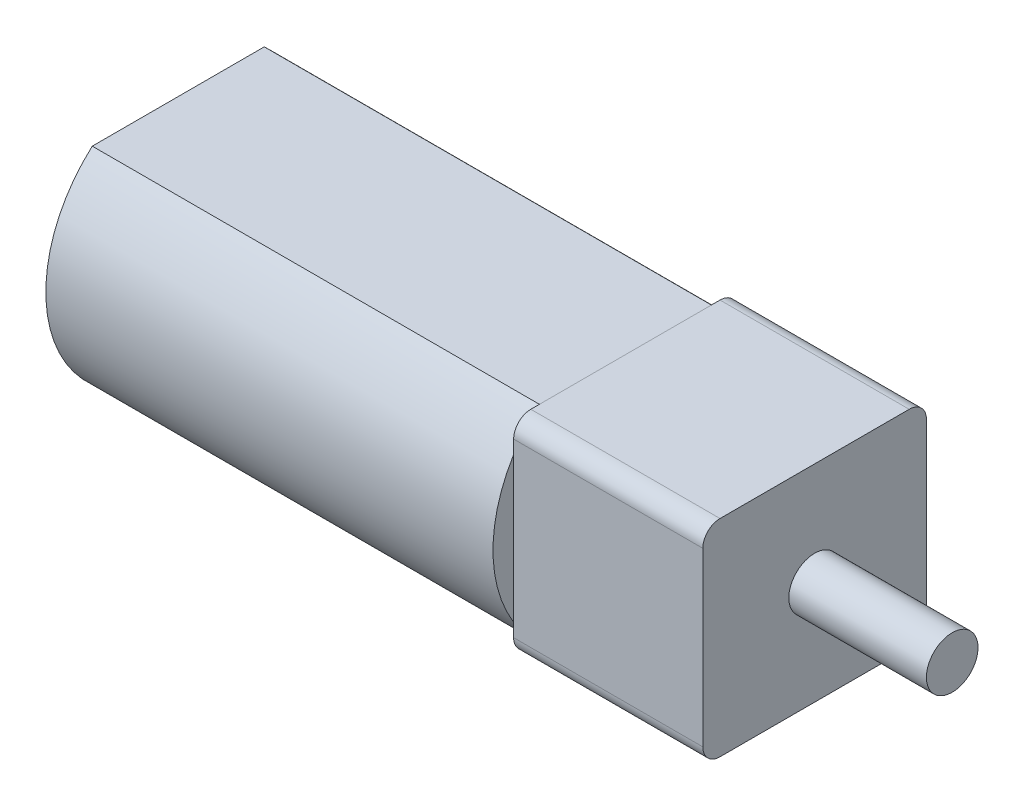
ISO-10303-21;
HEADER;
FILE_DESCRIPTION(('STEP AP214'),'2;1');
FILE_NAME('part.step','',(''),(''),'','','');
FILE_SCHEMA(('AUTOMOTIVE_DESIGN { 1 0 10303 214 1 1 1 1 }'));
ENDSEC;
DATA;
#1=APPLICATION_CONTEXT('core data for automotive mechanical design processes');
#2=APPLICATION_PROTOCOL_DEFINITION('international standard','automotive_design',2000,#1);
#3=PRODUCT_CONTEXT('',#1,'mechanical');
#4=PRODUCT('Part','Part','',(#3));
#5=PRODUCT_RELATED_PRODUCT_CATEGORY('part','',(#4));
#6=PRODUCT_DEFINITION_FORMATION('','',#4);
#7=PRODUCT_DEFINITION_CONTEXT('part definition',#1,'design');
#8=PRODUCT_DEFINITION('design','',#6,#7);
#9=PRODUCT_DEFINITION_SHAPE('','',#8);
#10=(LENGTH_UNIT() NAMED_UNIT(*) SI_UNIT(.MILLI.,.METRE.));
#11=(NAMED_UNIT(*) PLANE_ANGLE_UNIT() SI_UNIT($,.RADIAN.));
#12=(NAMED_UNIT(*) SI_UNIT($,.STERADIAN.) SOLID_ANGLE_UNIT());
#13=UNCERTAINTY_MEASURE_WITH_UNIT(LENGTH_MEASURE(1.E-05),#10,'distance_accuracy_value','');
#14=(GEOMETRIC_REPRESENTATION_CONTEXT(3) GLOBAL_UNCERTAINTY_ASSIGNED_CONTEXT((#13)) GLOBAL_UNIT_ASSIGNED_CONTEXT((#10,
#11,#12)) REPRESENTATION_CONTEXT('',''));
#15=CARTESIAN_POINT('',(0.,0.,0.));
#16=DIRECTION('',(0.,0.,1.));
#17=DIRECTION('',(1.,0.,0.));
#18=AXIS2_PLACEMENT_3D('',#15,#16,#17);
#19=CARTESIAN_POINT('',(45.,6.,-7.7));
#20=DIRECTION('',(-1.,0.,0.));
#21=DIRECTION('',(0.,0.,1.));
#22=AXIS2_PLACEMENT_3D('',#19,#20,#21);
#23=CYLINDRICAL_SURFACE('',#22,1.5);
#24=CARTESIAN_POINT('',(45.,6.,-7.7));
#25=DIRECTION('',(1.,0.,0.));
#26=DIRECTION('',(0.,0.,-1.));
#27=AXIS2_PLACEMENT_3D('',#24,#25,#26);
#28=CIRCLE('',#27,1.5);
#29=CARTESIAN_POINT('',(45.,6.,-9.2));
#30=VERTEX_POINT('',#29);
#31=EDGE_CURVE('E11',#30,#30,#28,.T.);
#32=ORIENTED_EDGE('',*,*,#31,.F.);
#33=EDGE_LOOP('',(#32));
#34=FACE_BOUND('',#33,.T.);
#35=CARTESIAN_POINT('',(37.,6.,-7.7));
#36=DIRECTION('',(1.,0.,0.));
#37=DIRECTION('',(0.,0.,-1.));
#38=AXIS2_PLACEMENT_3D('',#35,#36,#37);
#39=CIRCLE('',#38,1.5);
#40=CARTESIAN_POINT('',(37.,6.,-9.2));
#41=VERTEX_POINT('',#40);
#42=EDGE_CURVE('E59',#41,#41,#39,.T.);
#43=ORIENTED_EDGE('',*,*,#42,.T.);
#44=EDGE_LOOP('',(#43));
#45=FACE_BOUND('',#44,.T.);
#46=ADVANCED_FACE('F56',(#34,#45),#23,.T.);
#47=CARTESIAN_POINT('',(45.,6.,-7.7));
#48=DIRECTION('',(1.,0.,0.));
#49=DIRECTION('',(0.,0.,-1.));
#50=AXIS2_PLACEMENT_3D('',#47,#48,#49);
#51=PLANE('',#50);
#52=ORIENTED_EDGE('',*,*,#31,.T.);
#53=EDGE_LOOP('',(#52));
#54=FACE_BOUND('',#53,.T.);
#55=ADVANCED_FACE('F71',(#54),#51,.T.);
#56=CARTESIAN_POINT('',(37.,6.,-7.7));
#57=DIRECTION('',(1.,0.,0.));
#58=DIRECTION('',(0.,0.,-1.));
#59=AXIS2_PLACEMENT_3D('',#56,#57,#58);
#60=PLANE('',#59);
#61=ORIENTED_EDGE('',*,*,#42,.F.);
#62=EDGE_LOOP('',(#61));
#63=FACE_BOUND('',#62,.T.);
#64=ADVANCED_FACE('F69',(#63),#60,.F.);
#65=CLOSED_SHELL('',(#46,#55,#64));
#66=MANIFOLD_SOLID_BREP('B2',#65);
#67=CARTESIAN_POINT('',(37.,0.,-14.2));
#68=DIRECTION('',(0.,0.,1.));
#69=DIRECTION('',(1.,0.,0.));
#70=AXIS2_PLACEMENT_3D('',#67,#68,#69);
#71=PLANE('',#70);
#72=DIRECTION('',(0.,1.,0.));
#73=VECTOR('',#72,1.);
#74=CARTESIAN_POINT('',(37.,0.,-14.2));
#75=LINE('',#74,#73);
#76=CARTESIAN_POINT('',(37.,1.,-14.2));
#77=VERTEX_POINT('',#76);
#78=CARTESIAN_POINT('',(37.,11.,-14.2));
#79=VERTEX_POINT('',#78);
#80=EDGE_CURVE('E204',#77,#79,#75,.T.);
#81=ORIENTED_EDGE('',*,*,#80,.F.);
#82=DIRECTION('',(-1.,0.,0.));
#83=VECTOR('',#82,1.);
#84=CARTESIAN_POINT('',(37.,1.,-14.2));
#85=LINE('',#84,#83);
#86=CARTESIAN_POINT('',(26.,1.,-14.2));
#87=VERTEX_POINT('',#86);
#88=EDGE_CURVE('E230',#77,#87,#85,.T.);
#89=ORIENTED_EDGE('',*,*,#88,.T.);
#90=DIRECTION('',(0.,1.,0.));
#91=VECTOR('',#90,1.);
#92=CARTESIAN_POINT('',(26.,0.,-14.2));
#93=LINE('',#92,#91);
#94=CARTESIAN_POINT('',(26.,11.,-14.2));
#95=VERTEX_POINT('',#94);
#96=EDGE_CURVE('E236',#87,#95,#93,.T.);
#97=ORIENTED_EDGE('',*,*,#96,.T.);
#98=DIRECTION('',(-1.,0.,0.));
#99=VECTOR('',#98,1.);
#100=CARTESIAN_POINT('',(37.,11.,-14.2));
#101=LINE('',#100,#99);
#102=EDGE_CURVE('E228',#95,#79,#101,.F.);
#103=ORIENTED_EDGE('',*,*,#102,.T.);
#104=EDGE_LOOP('',(#81,#89,#97,#103));
#105=FACE_BOUND('',#104,.T.);
#106=ADVANCED_FACE('F112',(#105),#71,.F.);
#107=CARTESIAN_POINT('',(37.,12.,-1.2));
#108=DIRECTION('',(0.,-1.,0.));
#109=DIRECTION('',(0.,0.,-1.));
#110=AXIS2_PLACEMENT_3D('',#107,#108,#109);
#111=PLANE('',#110);
#112=DIRECTION('',(0.,0.,1.));
#113=VECTOR('',#112,1.);
#114=CARTESIAN_POINT('',(37.,12.,-1.2));
#115=LINE('',#114,#113);
#116=CARTESIAN_POINT('',(37.,12.,-13.2));
#117=VERTEX_POINT('',#116);
#118=CARTESIAN_POINT('',(37.,12.,-2.2));
#119=VERTEX_POINT('',#118);
#120=EDGE_CURVE('E207',#117,#119,#115,.T.);
#121=ORIENTED_EDGE('',*,*,#120,.F.);
#122=DIRECTION('',(-1.,0.,0.));
#123=VECTOR('',#122,1.);
#124=CARTESIAN_POINT('',(37.,12.,-13.2));
#125=LINE('',#124,#123);
#126=CARTESIAN_POINT('',(26.,12.,-13.2));
#127=VERTEX_POINT('',#126);
#128=EDGE_CURVE('E54',#117,#127,#125,.T.);
#129=ORIENTED_EDGE('',*,*,#128,.T.);
#130=DIRECTION('',(0.,0.,1.));
#131=VECTOR('',#130,1.);
#132=CARTESIAN_POINT('',(26.,12.,-1.2));
#133=LINE('',#132,#131);
#134=CARTESIAN_POINT('',(26.,12.,-2.2));
#135=VERTEX_POINT('',#134);
#136=EDGE_CURVE('E209',#127,#135,#133,.T.);
#137=ORIENTED_EDGE('',*,*,#136,.T.);
#138=DIRECTION('',(-1.,0.,0.));
#139=VECTOR('',#138,1.);
#140=CARTESIAN_POINT('',(37.,12.,-2.2));
#141=LINE('',#140,#139);
#142=EDGE_CURVE('E120',#135,#119,#141,.F.);
#143=ORIENTED_EDGE('',*,*,#142,.T.);
#144=EDGE_LOOP('',(#121,#129,#137,#143));
#145=FACE_BOUND('',#144,.T.);
#146=ADVANCED_FACE('F255',(#145),#111,.F.);
#147=CARTESIAN_POINT('',(37.,0.,-1.2));
#148=DIRECTION('',(0.,0.,-1.));
#149=DIRECTION('',(-1.,0.,0.));
#150=AXIS2_PLACEMENT_3D('',#147,#148,#149);
#151=PLANE('',#150);
#152=DIRECTION('',(0.,-1.,0.));
#153=VECTOR('',#152,1.);
#154=CARTESIAN_POINT('',(26.,0.,-1.2));
#155=LINE('',#154,#153);
#156=CARTESIAN_POINT('',(26.,11.,-1.2));
#157=VERTEX_POINT('',#156);
#158=CARTESIAN_POINT('',(26.,1.,-1.2));
#159=VERTEX_POINT('',#158);
#160=EDGE_CURVE('E205',#157,#159,#155,.T.);
#161=ORIENTED_EDGE('',*,*,#160,.T.);
#162=DIRECTION('',(-1.,0.,0.));
#163=VECTOR('',#162,1.);
#164=CARTESIAN_POINT('',(37.,1.,-1.2));
#165=LINE('',#164,#163);
#166=CARTESIAN_POINT('',(37.,1.,-1.2));
#167=VERTEX_POINT('',#166);
#168=EDGE_CURVE('E183',#159,#167,#165,.F.);
#169=ORIENTED_EDGE('',*,*,#168,.T.);
#170=DIRECTION('',(0.,-1.,0.));
#171=VECTOR('',#170,1.);
#172=CARTESIAN_POINT('',(37.,0.,-1.2));
#173=LINE('',#172,#171);
#174=CARTESIAN_POINT('',(37.,11.,-1.2));
#175=VERTEX_POINT('',#174);
#176=EDGE_CURVE('E244',#175,#167,#173,.T.);
#177=ORIENTED_EDGE('',*,*,#176,.F.);
#178=DIRECTION('',(-1.,0.,0.));
#179=VECTOR('',#178,1.);
#180=CARTESIAN_POINT('',(37.,11.,-1.2));
#181=LINE('',#180,#179);
#182=EDGE_CURVE('E188',#175,#157,#181,.T.);
#183=ORIENTED_EDGE('',*,*,#182,.T.);
#184=EDGE_LOOP('',(#161,#169,#177,#183));
#185=FACE_BOUND('',#184,.T.);
#186=ADVANCED_FACE('F254',(#185),#151,.F.);
#187=CARTESIAN_POINT('',(37.,0.,-1.2));
#188=DIRECTION('',(0.,1.,0.));
#189=DIRECTION('',(0.,0.,1.));
#190=AXIS2_PLACEMENT_3D('',#187,#188,#189);
#191=PLANE('',#190);
#192=DIRECTION('',(0.,0.,-1.));
#193=VECTOR('',#192,1.);
#194=CARTESIAN_POINT('',(37.,0.,-1.2));
#195=LINE('',#194,#193);
#196=CARTESIAN_POINT('',(37.,0.,-2.2));
#197=VERTEX_POINT('',#196);
#198=CARTESIAN_POINT('',(37.,0.,-13.2));
#199=VERTEX_POINT('',#198);
#200=EDGE_CURVE('E198',#197,#199,#195,.T.);
#201=ORIENTED_EDGE('',*,*,#200,.F.);
#202=DIRECTION('',(-1.,0.,0.));
#203=VECTOR('',#202,1.);
#204=CARTESIAN_POINT('',(37.,0.,-2.2));
#205=LINE('',#204,#203);
#206=CARTESIAN_POINT('',(26.,0.,-2.2));
#207=VERTEX_POINT('',#206);
#208=EDGE_CURVE('E182',#197,#207,#205,.T.);
#209=ORIENTED_EDGE('',*,*,#208,.T.);
#210=DIRECTION('',(0.,0.,-1.));
#211=VECTOR('',#210,1.);
#212=CARTESIAN_POINT('',(26.,0.,-1.2));
#213=LINE('',#212,#211);
#214=CARTESIAN_POINT('',(26.,0.,-13.2));
#215=VERTEX_POINT('',#214);
#216=EDGE_CURVE('E195',#207,#215,#213,.T.);
#217=ORIENTED_EDGE('',*,*,#216,.T.);
#218=DIRECTION('',(-1.,0.,0.));
#219=VECTOR('',#218,1.);
#220=CARTESIAN_POINT('',(37.,0.,-13.2));
#221=LINE('',#220,#219);
#222=EDGE_CURVE('E200',#215,#199,#221,.F.);
#223=ORIENTED_EDGE('',*,*,#222,.T.);
#224=EDGE_LOOP('',(#201,#209,#217,#223));
#225=FACE_BOUND('',#224,.T.);
#226=ADVANCED_FACE('F194',(#225),#191,.F.);
#227=CARTESIAN_POINT('',(37.,0.,0.));
#228=DIRECTION('',(-1.,0.,0.));
#229=DIRECTION('',(0.,0.,1.));
#230=AXIS2_PLACEMENT_3D('',#227,#228,#229);
#231=PLANE('',#230);
#232=ORIENTED_EDGE('',*,*,#176,.T.);
#233=CARTESIAN_POINT('',(37.,1.,-2.2));
#234=DIRECTION('',(-1.,0.,0.));
#235=DIRECTION('',(0.,0.,1.));
#236=AXIS2_PLACEMENT_3D('',#233,#234,#235);
#237=CIRCLE('',#236,1.);
#238=EDGE_CURVE('E226',#167,#197,#237,.F.);
#239=ORIENTED_EDGE('',*,*,#238,.T.);
#240=ORIENTED_EDGE('',*,*,#200,.T.);
#241=CARTESIAN_POINT('',(37.,1.,-13.2));
#242=DIRECTION('',(-1.,0.,0.));
#243=DIRECTION('',(0.,0.,1.));
#244=AXIS2_PLACEMENT_3D('',#241,#242,#243);
#245=CIRCLE('',#244,1.);
#246=EDGE_CURVE('E224',#199,#77,#245,.F.);
#247=ORIENTED_EDGE('',*,*,#246,.T.);
#248=ORIENTED_EDGE('',*,*,#80,.T.);
#249=CARTESIAN_POINT('',(37.,11.,-13.2));
#250=DIRECTION('',(-1.,0.,0.));
#251=DIRECTION('',(0.,0.,1.));
#252=AXIS2_PLACEMENT_3D('',#249,#250,#251);
#253=CIRCLE('',#252,1.);
#254=EDGE_CURVE('E133',#79,#117,#253,.F.);
#255=ORIENTED_EDGE('',*,*,#254,.T.);
#256=ORIENTED_EDGE('',*,*,#120,.T.);
#257=CARTESIAN_POINT('',(37.,11.,-2.2));
#258=DIRECTION('',(-1.,0.,0.));
#259=DIRECTION('',(0.,0.,1.));
#260=AXIS2_PLACEMENT_3D('',#257,#258,#259);
#261=CIRCLE('',#260,1.);
#262=EDGE_CURVE('E221',#119,#175,#261,.F.);
#263=ORIENTED_EDGE('',*,*,#262,.T.);
#264=EDGE_LOOP('',(#232,#239,#240,#247,#248,#255,#256,#263));
#265=FACE_BOUND('',#264,.T.);
#266=ADVANCED_FACE('F248',(#265),#231,.F.);
#267=CARTESIAN_POINT('',(26.,0.,0.));
#268=DIRECTION('',(-1.,0.,0.));
#269=DIRECTION('',(0.,0.,1.));
#270=AXIS2_PLACEMENT_3D('',#267,#268,#269);
#271=PLANE('',#270);
#272=ORIENTED_EDGE('',*,*,#216,.F.);
#273=CARTESIAN_POINT('',(26.,1.,-2.2));
#274=DIRECTION('',(-1.,0.,0.));
#275=DIRECTION('',(0.,0.,1.));
#276=AXIS2_PLACEMENT_3D('',#273,#274,#275);
#277=CIRCLE('',#276,1.);
#278=EDGE_CURVE('E178',#207,#159,#277,.T.);
#279=ORIENTED_EDGE('',*,*,#278,.T.);
#280=ORIENTED_EDGE('',*,*,#160,.F.);
#281=CARTESIAN_POINT('',(26.,11.,-2.2));
#282=DIRECTION('',(-1.,0.,0.));
#283=DIRECTION('',(0.,0.,1.));
#284=AXIS2_PLACEMENT_3D('',#281,#282,#283);
#285=CIRCLE('',#284,1.);
#286=EDGE_CURVE('E199',#157,#135,#285,.T.);
#287=ORIENTED_EDGE('',*,*,#286,.T.);
#288=ORIENTED_EDGE('',*,*,#136,.F.);
#289=CARTESIAN_POINT('',(26.,11.,-13.2));
#290=DIRECTION('',(-1.,0.,0.));
#291=DIRECTION('',(0.,0.,1.));
#292=AXIS2_PLACEMENT_3D('',#289,#290,#291);
#293=CIRCLE('',#292,1.);
#294=EDGE_CURVE('E215',#127,#95,#293,.T.);
#295=ORIENTED_EDGE('',*,*,#294,.T.);
#296=ORIENTED_EDGE('',*,*,#96,.F.);
#297=CARTESIAN_POINT('',(26.,1.,-13.2));
#298=DIRECTION('',(-1.,0.,0.));
#299=DIRECTION('',(0.,0.,1.));
#300=AXIS2_PLACEMENT_3D('',#297,#298,#299);
#301=CIRCLE('',#300,1.);
#302=EDGE_CURVE('E189',#87,#215,#301,.T.);
#303=ORIENTED_EDGE('',*,*,#302,.T.);
#304=EDGE_LOOP('',(#272,#279,#280,#287,#288,#295,#296,#303));
#305=FACE_BOUND('',#304,.T.);
#306=ADVANCED_FACE('F202',(#305),#271,.T.);
#307=CARTESIAN_POINT('',(37.,1.,-2.2));
#308=DIRECTION('',(-1.,0.,0.));
#309=DIRECTION('',(0.,0.,1.));
#310=AXIS2_PLACEMENT_3D('',#307,#308,#309);
#311=CYLINDRICAL_SURFACE('',#310,1.);
#312=ORIENTED_EDGE('',*,*,#238,.F.);
#313=ORIENTED_EDGE('',*,*,#168,.F.);
#314=ORIENTED_EDGE('',*,*,#278,.F.);
#315=ORIENTED_EDGE('',*,*,#208,.F.);
#316=EDGE_LOOP('',(#312,#313,#314,#315));
#317=FACE_BOUND('',#316,.T.);
#318=ADVANCED_FACE('F181',(#317),#311,.T.);
#319=CARTESIAN_POINT('',(37.,1.,-13.2));
#320=DIRECTION('',(-1.,0.,0.));
#321=DIRECTION('',(0.,0.,1.));
#322=AXIS2_PLACEMENT_3D('',#319,#320,#321);
#323=CYLINDRICAL_SURFACE('',#322,1.);
#324=ORIENTED_EDGE('',*,*,#246,.F.);
#325=ORIENTED_EDGE('',*,*,#222,.F.);
#326=ORIENTED_EDGE('',*,*,#302,.F.);
#327=ORIENTED_EDGE('',*,*,#88,.F.);
#328=EDGE_LOOP('',(#324,#325,#326,#327));
#329=FACE_BOUND('',#328,.T.);
#330=ADVANCED_FACE('F258',(#329),#323,.T.);
#331=CARTESIAN_POINT('',(37.,11.,-13.2));
#332=DIRECTION('',(-1.,0.,0.));
#333=DIRECTION('',(0.,0.,1.));
#334=AXIS2_PLACEMENT_3D('',#331,#332,#333);
#335=CYLINDRICAL_SURFACE('',#334,1.);
#336=ORIENTED_EDGE('',*,*,#254,.F.);
#337=ORIENTED_EDGE('',*,*,#102,.F.);
#338=ORIENTED_EDGE('',*,*,#294,.F.);
#339=ORIENTED_EDGE('',*,*,#128,.F.);
#340=EDGE_LOOP('',(#336,#337,#338,#339));
#341=FACE_BOUND('',#340,.T.);
#342=ADVANCED_FACE('F257',(#341),#335,.T.);
#343=CARTESIAN_POINT('',(37.,11.,-2.2));
#344=DIRECTION('',(-1.,0.,0.));
#345=DIRECTION('',(0.,0.,1.));
#346=AXIS2_PLACEMENT_3D('',#343,#344,#345);
#347=CYLINDRICAL_SURFACE('',#346,1.);
#348=ORIENTED_EDGE('',*,*,#262,.F.);
#349=ORIENTED_EDGE('',*,*,#142,.F.);
#350=ORIENTED_EDGE('',*,*,#286,.F.);
#351=ORIENTED_EDGE('',*,*,#182,.F.);
#352=EDGE_LOOP('',(#348,#349,#350,#351));
#353=FACE_BOUND('',#352,.T.);
#354=ADVANCED_FACE('F114',(#353),#347,.T.);
#355=CLOSED_SHELL('',(#106,#146,#186,#226,#266,#306,#318,#330,#342,#354));
#356=MANIFOLD_SOLID_BREP('B6',#355);
#357=CARTESIAN_POINT('',(26.,6.,-8.01666666666667));
#358=DIRECTION('',(-1.,0.,0.));
#359=DIRECTION('',(0.,0.,1.));
#360=AXIS2_PLACEMENT_3D('',#357,#358,#359);
#361=CYLINDRICAL_SURFACE('',#360,8.01666666666667);
#362=CARTESIAN_POINT('',(0.,6.,-8.01666666666667));
#363=DIRECTION('',(1.,0.,0.));
#364=DIRECTION('',(0.,0.,-1.));
#365=AXIS2_PLACEMENT_3D('',#362,#363,#364);
#366=CIRCLE('',#365,8.01666666666667);
#367=CARTESIAN_POINT('',(0.,12.,-2.7));
#368=VERTEX_POINT('',#367);
#369=CARTESIAN_POINT('',(0.,0.,-2.7));
#370=VERTEX_POINT('',#369);
#371=EDGE_CURVE('E442',#368,#370,#366,.T.);
#372=ORIENTED_EDGE('',*,*,#371,.T.);
#373=DIRECTION('',(-1.,0.,0.));
#374=VECTOR('',#373,1.);
#375=CARTESIAN_POINT('',(26.,0.,-2.7));
#376=LINE('',#375,#374);
#377=CARTESIAN_POINT('',(26.,0.,-2.7));
#378=VERTEX_POINT('',#377);
#379=EDGE_CURVE('E433',#378,#370,#376,.T.);
#380=ORIENTED_EDGE('',*,*,#379,.F.);
#381=CARTESIAN_POINT('',(26.,6.,-8.01666666666667));
#382=DIRECTION('',(1.,0.,0.));
#383=DIRECTION('',(0.,0.,-1.));
#384=AXIS2_PLACEMENT_3D('',#381,#382,#383);
#385=CIRCLE('',#384,8.01666666666667);
#386=CARTESIAN_POINT('',(26.,12.,-2.7));
#387=VERTEX_POINT('',#386);
#388=EDGE_CURVE('E427',#387,#378,#385,.T.);
#389=ORIENTED_EDGE('',*,*,#388,.F.);
#390=DIRECTION('',(-1.,0.,0.));
#391=VECTOR('',#390,1.);
#392=CARTESIAN_POINT('',(26.,12.,-2.7));
#393=LINE('',#392,#391);
#394=EDGE_CURVE('E438',#387,#368,#393,.T.);
#395=ORIENTED_EDGE('',*,*,#394,.T.);
#396=EDGE_LOOP('',(#372,#380,#389,#395));
#397=FACE_BOUND('',#396,.T.);
#398=ADVANCED_FACE('F374',(#397),#361,.T.);
#399=CARTESIAN_POINT('',(26.,0.,-2.7));
#400=DIRECTION('',(0.,1.,0.));
#401=DIRECTION('',(0.,0.,1.));
#402=AXIS2_PLACEMENT_3D('',#399,#400,#401);
#403=PLANE('',#402);
#404=DIRECTION('',(0.,0.,-1.));
#405=VECTOR('',#404,1.);
#406=CARTESIAN_POINT('',(0.,0.,-2.7));
#407=LINE('',#406,#405);
#408=CARTESIAN_POINT('',(0.,0.,-12.7));
#409=VERTEX_POINT('',#408);
#410=EDGE_CURVE('E432',#370,#409,#407,.T.);
#411=ORIENTED_EDGE('',*,*,#410,.T.);
#412=DIRECTION('',(-1.,0.,0.));
#413=VECTOR('',#412,1.);
#414=CARTESIAN_POINT('',(26.,0.,-12.7));
#415=LINE('',#414,#413);
#416=CARTESIAN_POINT('',(26.,0.,-12.7));
#417=VERTEX_POINT('',#416);
#418=EDGE_CURVE('E430',#417,#409,#415,.T.);
#419=ORIENTED_EDGE('',*,*,#418,.F.);
#420=DIRECTION('',(0.,0.,-1.));
#421=VECTOR('',#420,1.);
#422=CARTESIAN_POINT('',(26.,0.,-2.7));
#423=LINE('',#422,#421);
#424=EDGE_CURVE('E422',#378,#417,#423,.T.);
#425=ORIENTED_EDGE('',*,*,#424,.F.);
#426=ORIENTED_EDGE('',*,*,#379,.T.);
#427=EDGE_LOOP('',(#411,#419,#425,#426));
#428=FACE_BOUND('',#427,.T.);
#429=ADVANCED_FACE('F431',(#428),#403,.F.);
#430=CARTESIAN_POINT('',(26.,6.,-7.38333333333333));
#431=DIRECTION('',(-1.,0.,0.));
#432=DIRECTION('',(0.,0.,1.));
#433=AXIS2_PLACEMENT_3D('',#430,#431,#432);
#434=CYLINDRICAL_SURFACE('',#433,8.01666666666667);
#435=CARTESIAN_POINT('',(0.,6.,-7.38333333333333));
#436=DIRECTION('',(1.,0.,0.));
#437=DIRECTION('',(0.,0.,1.));
#438=AXIS2_PLACEMENT_3D('',#435,#436,#437);
#439=CIRCLE('',#438,8.01666666666667);
#440=CARTESIAN_POINT('',(0.,12.,-12.7));
#441=VERTEX_POINT('',#440);
#442=EDGE_CURVE('E408',#409,#441,#439,.T.);
#443=ORIENTED_EDGE('',*,*,#442,.T.);
#444=DIRECTION('',(-1.,0.,0.));
#445=VECTOR('',#444,1.);
#446=CARTESIAN_POINT('',(26.,12.,-12.7));
#447=LINE('',#446,#445);
#448=CARTESIAN_POINT('',(26.,12.,-12.7));
#449=VERTEX_POINT('',#448);
#450=EDGE_CURVE('E434',#449,#441,#447,.T.);
#451=ORIENTED_EDGE('',*,*,#450,.F.);
#452=CARTESIAN_POINT('',(26.,6.,-7.38333333333333));
#453=DIRECTION('',(1.,0.,0.));
#454=DIRECTION('',(0.,0.,1.));
#455=AXIS2_PLACEMENT_3D('',#452,#453,#454);
#456=CIRCLE('',#455,8.01666666666667);
#457=EDGE_CURVE('E425',#417,#449,#456,.T.);
#458=ORIENTED_EDGE('',*,*,#457,.F.);
#459=ORIENTED_EDGE('',*,*,#418,.T.);
#460=EDGE_LOOP('',(#443,#451,#458,#459));
#461=FACE_BOUND('',#460,.T.);
#462=ADVANCED_FACE('F436',(#461),#434,.T.);
#463=CARTESIAN_POINT('',(26.,12.,-2.7));
#464=DIRECTION('',(0.,-1.,0.));
#465=DIRECTION('',(0.,0.,-1.));
#466=AXIS2_PLACEMENT_3D('',#463,#464,#465);
#467=PLANE('',#466);
#468=DIRECTION('',(0.,0.,1.));
#469=VECTOR('',#468,1.);
#470=CARTESIAN_POINT('',(0.,12.,-2.7));
#471=LINE('',#470,#469);
#472=EDGE_CURVE('E414',#441,#368,#471,.T.);
#473=ORIENTED_EDGE('',*,*,#472,.T.);
#474=ORIENTED_EDGE('',*,*,#394,.F.);
#475=DIRECTION('',(0.,0.,1.));
#476=VECTOR('',#475,1.);
#477=CARTESIAN_POINT('',(26.,12.,-2.7));
#478=LINE('',#477,#476);
#479=EDGE_CURVE('E391',#449,#387,#478,.T.);
#480=ORIENTED_EDGE('',*,*,#479,.F.);
#481=ORIENTED_EDGE('',*,*,#450,.T.);
#482=EDGE_LOOP('',(#473,#474,#480,#481));
#483=FACE_BOUND('',#482,.T.);
#484=ADVANCED_FACE('F466',(#483),#467,.F.);
#485=CARTESIAN_POINT('',(26.,6.,-8.01666666666667));
#486=DIRECTION('',(1.,0.,0.));
#487=DIRECTION('',(0.,0.,-1.));
#488=AXIS2_PLACEMENT_3D('',#485,#486,#487);
#489=PLANE('',#488);
#490=ORIENTED_EDGE('',*,*,#388,.T.);
#491=ORIENTED_EDGE('',*,*,#424,.T.);
#492=ORIENTED_EDGE('',*,*,#457,.T.);
#493=ORIENTED_EDGE('',*,*,#479,.T.);
#494=EDGE_LOOP('',(#490,#491,#492,#493));
#495=FACE_BOUND('',#494,.T.);
#496=ADVANCED_FACE('F423',(#495),#489,.T.);
#497=CARTESIAN_POINT('',(0.,6.,-8.01666666666667));
#498=DIRECTION('',(1.,0.,0.));
#499=DIRECTION('',(0.,0.,-1.));
#500=AXIS2_PLACEMENT_3D('',#497,#498,#499);
#501=PLANE('',#500);
#502=CARTESIAN_POINT('',(0.,6.,-7.69999999999999));
#503=DIRECTION('',(-1.,0.,0.));
#504=DIRECTION('',(0.,0.,1.));
#505=AXIS2_PLACEMENT_3D('',#502,#503,#504);
#506=CIRCLE('',#505,2.5);
#507=CARTESIAN_POINT('',(0.,6.,-5.19999999999999));
#508=VERTEX_POINT('',#507);
#509=EDGE_CURVE('E450',#508,#508,#506,.T.);
#510=ORIENTED_EDGE('',*,*,#509,.F.);
#511=EDGE_LOOP('',(#510));
#512=FACE_BOUND('',#511,.T.);
#513=ORIENTED_EDGE('',*,*,#371,.F.);
#514=ORIENTED_EDGE('',*,*,#472,.F.);
#515=ORIENTED_EDGE('',*,*,#442,.F.);
#516=ORIENTED_EDGE('',*,*,#410,.F.);
#517=EDGE_LOOP('',(#513,#514,#515,#516));
#518=FACE_BOUND('',#517,.T.);
#519=ADVANCED_FACE('F460',(#512,#518),#501,.F.);
#520=CARTESIAN_POINT('',(-2.,6.,-7.69999999999999));
#521=DIRECTION('',(1.,0.,0.));
#522=DIRECTION('',(0.,0.,-1.));
#523=AXIS2_PLACEMENT_3D('',#520,#521,#522);
#524=CYLINDRICAL_SURFACE('',#523,2.5);
#525=CARTESIAN_POINT('',(-1.5,6.,-7.69999999999999));
#526=DIRECTION('',(-1.,0.,0.));
#527=DIRECTION('',(0.,0.,1.));
#528=AXIS2_PLACEMENT_3D('',#525,#526,#527);
#529=CIRCLE('',#528,2.5);
#530=CARTESIAN_POINT('',(-1.5,6.,-5.19999999999999));
#531=VERTEX_POINT('',#530);
#532=EDGE_CURVE('E110',#531,#531,#529,.F.);
#533=ORIENTED_EDGE('',*,*,#532,.T.);
#534=EDGE_LOOP('',(#533));
#535=FACE_BOUND('',#534,.T.);
#536=ORIENTED_EDGE('',*,*,#509,.T.);
#537=EDGE_LOOP('',(#536));
#538=FACE_BOUND('',#537,.T.);
#539=ADVANCED_FACE('F458',(#535,#538),#524,.T.);
#540=CARTESIAN_POINT('',(-2.,6.,-7.69999999999999));
#541=DIRECTION('',(-1.,0.,0.));
#542=DIRECTION('',(0.,0.,1.));
#543=AXIS2_PLACEMENT_3D('',#540,#541,#542);
#544=PLANE('',#543);
#545=CARTESIAN_POINT('',(-2.,6.,-7.69999999999999));
#546=DIRECTION('',(-1.,0.,0.));
#547=DIRECTION('',(0.,0.,1.));
#548=AXIS2_PLACEMENT_3D('',#545,#546,#547);
#549=CIRCLE('',#548,2.);
#550=CARTESIAN_POINT('',(-2.,6.,-5.69999999999999));
#551=VERTEX_POINT('',#550);
#552=EDGE_CURVE('E383',#551,#551,#549,.T.);
#553=ORIENTED_EDGE('',*,*,#552,.T.);
#554=EDGE_LOOP('',(#553));
#555=FACE_BOUND('',#554,.T.);
#556=ADVANCED_FACE('F512',(#555),#544,.T.);
#557=CARTESIAN_POINT('',(-1.5,6.,-7.69999999999999));
#558=DIRECTION('',(-1.,0.,0.));
#559=DIRECTION('',(0.,0.,1.));
#560=AXIS2_PLACEMENT_3D('',#557,#558,#559);
#561=TOROIDAL_SURFACE('',#560,2.,0.5);
#562=ORIENTED_EDGE('',*,*,#532,.F.);
#563=EDGE_LOOP('',(#562));
#564=FACE_BOUND('',#563,.T.);
#565=ORIENTED_EDGE('',*,*,#552,.F.);
#566=EDGE_LOOP('',(#565));
#567=FACE_BOUND('',#566,.T.);
#568=ADVANCED_FACE('F376',(#564,#567),#561,.T.);
#569=CLOSED_SHELL('',(#398,#429,#462,#484,#496,#519,#539,#556,#568));
#570=MANIFOLD_SOLID_BREP('B48',#569);
#571=ADVANCED_BREP_SHAPE_REPRESENTATION('',(#18,#66,#356,#570),#14);
#572=SHAPE_DEFINITION_REPRESENTATION(#9,#571);
ENDSEC;
END-ISO-10303-21;
